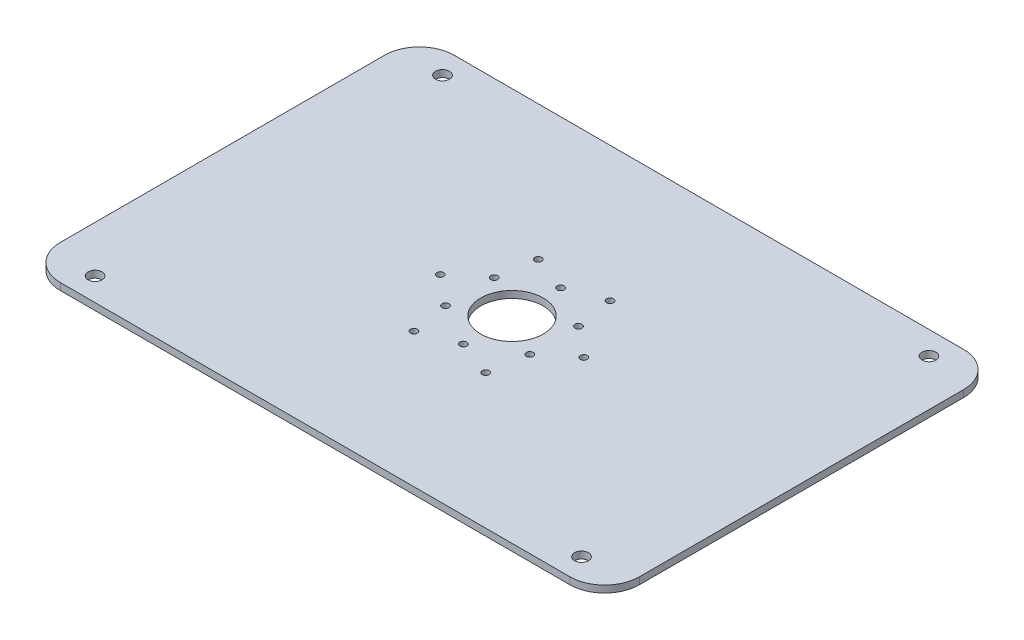
ISO-10303-21;
HEADER;
FILE_DESCRIPTION(('STEP AP214'),'2;1');
FILE_NAME('part.step','',(''),(''),'','','');
FILE_SCHEMA(('AUTOMOTIVE_DESIGN { 1 0 10303 214 1 1 1 1 }'));
ENDSEC;
DATA;
#1=APPLICATION_CONTEXT('core data for automotive mechanical design processes');
#2=APPLICATION_PROTOCOL_DEFINITION('international standard','automotive_design',2000,#1);
#3=PRODUCT_CONTEXT('',#1,'mechanical');
#4=PRODUCT('Part','Part','',(#3));
#5=PRODUCT_RELATED_PRODUCT_CATEGORY('part','',(#4));
#6=PRODUCT_DEFINITION_FORMATION('','',#4);
#7=PRODUCT_DEFINITION_CONTEXT('part definition',#1,'design');
#8=PRODUCT_DEFINITION('design','',#6,#7);
#9=PRODUCT_DEFINITION_SHAPE('','',#8);
#10=(LENGTH_UNIT() NAMED_UNIT(*) SI_UNIT(.MILLI.,.METRE.));
#11=(NAMED_UNIT(*) PLANE_ANGLE_UNIT() SI_UNIT($,.RADIAN.));
#12=(NAMED_UNIT(*) SI_UNIT($,.STERADIAN.) SOLID_ANGLE_UNIT());
#13=UNCERTAINTY_MEASURE_WITH_UNIT(LENGTH_MEASURE(1.E-05),#10,'distance_accuracy_value','');
#14=(GEOMETRIC_REPRESENTATION_CONTEXT(3) GLOBAL_UNCERTAINTY_ASSIGNED_CONTEXT((#13)) GLOBAL_UNIT_ASSIGNED_CONTEXT((#10,
#11,#12)) REPRESENTATION_CONTEXT('',''));
#15=CARTESIAN_POINT('',(0.,0.,0.));
#16=DIRECTION('',(0.,0.,1.));
#17=DIRECTION('',(1.,0.,0.));
#18=AXIS2_PLACEMENT_3D('',#15,#16,#17);
#19=CARTESIAN_POINT('',(0.,3.,0.));
#20=DIRECTION('',(0.,-1.,0.));
#21=DIRECTION('',(0.,0.,-1.));
#22=AXIS2_PLACEMENT_3D('',#19,#20,#21);
#23=PLANE('',#22);
#24=CARTESIAN_POINT('',(-18.1865334794709,3.,-10.5000000000041));
#25=DIRECTION('',(0.,1.,0.));
#26=DIRECTION('',(0.,0.,1.));
#27=AXIS2_PLACEMENT_3D('',#24,#25,#26);
#28=CIRCLE('',#27,1.49999999999574);
#29=CARTESIAN_POINT('',(-18.1865334794709,3.,-9.00000000000834));
#30=VERTEX_POINT('',#29);
#31=EDGE_CURVE('E213',#30,#30,#28,.T.);
#32=ORIENTED_EDGE('',*,*,#31,.F.);
#33=EDGE_LOOP('',(#32));
#34=FACE_BOUND('',#33,.T.);
#35=CARTESIAN_POINT('',(31.,3.,0.));
#36=DIRECTION('',(0.,1.,0.));
#37=DIRECTION('',(0.,0.,1.));
#38=AXIS2_PLACEMENT_3D('',#35,#36,#37);
#39=CIRCLE('',#38,1.5);
#40=CARTESIAN_POINT('',(31.,3.,1.5));
#41=VERTEX_POINT('',#40);
#42=EDGE_CURVE('E236',#41,#41,#39,.T.);
#43=ORIENTED_EDGE('',*,*,#42,.F.);
#44=EDGE_LOOP('',(#43));
#45=FACE_BOUND('',#44,.T.);
#46=CARTESIAN_POINT('',(1.78542417755903E-12,3.,0.));
#47=DIRECTION('',(0.,1.,0.));
#48=DIRECTION('',(0.,0.,1.));
#49=AXIS2_PLACEMENT_3D('',#46,#47,#48);
#50=CIRCLE('',#49,13.5);
#51=CARTESIAN_POINT('',(1.78542417755903E-12,3.,13.5));
#52=VERTEX_POINT('',#51);
#53=EDGE_CURVE('E237',#52,#52,#50,.T.);
#54=ORIENTED_EDGE('',*,*,#53,.F.);
#55=EDGE_LOOP('',(#54));
#56=FACE_BOUND('',#55,.T.);
#57=CARTESIAN_POINT('',(15.4999999999999,3.,26.8467875173176));
#58=DIRECTION('',(0.,1.,0.));
#59=DIRECTION('',(0.,0.,1.));
#60=AXIS2_PLACEMENT_3D('',#57,#58,#59);
#61=CIRCLE('',#60,1.5);
#62=CARTESIAN_POINT('',(15.4999999999999,3.,28.3467875173176));
#63=VERTEX_POINT('',#62);
#64=EDGE_CURVE('E248',#63,#63,#61,.T.);
#65=ORIENTED_EDGE('',*,*,#64,.F.);
#66=EDGE_LOOP('',(#65));
#67=FACE_BOUND('',#66,.T.);
#68=CARTESIAN_POINT('',(-18.1865334794751,3.,10.4999999999967));
#69=DIRECTION('',(0.,1.,0.));
#70=DIRECTION('',(0.,0.,1.));
#71=AXIS2_PLACEMENT_3D('',#68,#69,#70);
#72=CIRCLE('',#71,1.49999999999659);
#73=CARTESIAN_POINT('',(-18.1865334794751,3.,11.9999999999933));
#74=VERTEX_POINT('',#73);
#75=EDGE_CURVE('E212',#74,#74,#72,.T.);
#76=ORIENTED_EDGE('',*,*,#75,.F.);
#77=EDGE_LOOP('',(#76));
#78=FACE_BOUND('',#77,.T.);
#79=CARTESIAN_POINT('',(-1.46642216231412E-13,3.,21.));
#80=DIRECTION('',(0.,1.,0.));
#81=DIRECTION('',(0.,0.,1.));
#82=AXIS2_PLACEMENT_3D('',#79,#80,#81);
#83=CIRCLE('',#82,1.5);
#84=CARTESIAN_POINT('',(-1.46642216231412E-13,3.,22.5));
#85=VERTEX_POINT('',#84);
#86=EDGE_CURVE('E219',#85,#85,#83,.T.);
#87=ORIENTED_EDGE('',*,*,#86,.F.);
#88=EDGE_LOOP('',(#87));
#89=FACE_BOUND('',#88,.T.);
#90=CARTESIAN_POINT('',(18.1865334794732,3.,10.5000000000001));
#91=DIRECTION('',(0.,1.,0.));
#92=DIRECTION('',(0.,0.,1.));
#93=AXIS2_PLACEMENT_3D('',#90,#91,#92);
#94=CIRCLE('',#93,1.5);
#95=CARTESIAN_POINT('',(18.1865334794732,3.,12.0000000000001));
#96=VERTEX_POINT('',#95);
#97=EDGE_CURVE('E225',#96,#96,#94,.T.);
#98=ORIENTED_EDGE('',*,*,#97,.F.);
#99=EDGE_LOOP('',(#98));
#100=FACE_BOUND('',#99,.T.);
#101=CARTESIAN_POINT('',(18.1865334794732,3.,-10.5));
#102=DIRECTION('',(0.,1.,0.));
#103=DIRECTION('',(0.,0.,1.));
#104=AXIS2_PLACEMENT_3D('',#101,#102,#103);
#105=CIRCLE('',#104,1.5);
#106=CARTESIAN_POINT('',(18.1865334794732,3.,-8.99999999999996));
#107=VERTEX_POINT('',#106);
#108=EDGE_CURVE('E206',#107,#107,#105,.T.);
#109=ORIENTED_EDGE('',*,*,#108,.F.);
#110=EDGE_LOOP('',(#109));
#111=FACE_BOUND('',#110,.T.);
#112=CARTESIAN_POINT('',(-15.5000000000001,3.,26.8467875173175));
#113=DIRECTION('',(0.,1.,0.));
#114=DIRECTION('',(0.,0.,1.));
#115=AXIS2_PLACEMENT_3D('',#112,#113,#114);
#116=CIRCLE('',#115,1.5);
#117=CARTESIAN_POINT('',(-15.5000000000001,3.,28.3467875173175));
#118=VERTEX_POINT('',#117);
#119=EDGE_CURVE('E249',#118,#118,#116,.T.);
#120=ORIENTED_EDGE('',*,*,#119,.F.);
#121=EDGE_LOOP('',(#120));
#122=FACE_BOUND('',#121,.T.);
#123=CARTESIAN_POINT('',(-31.,3.,0.));
#124=DIRECTION('',(0.,1.,0.));
#125=DIRECTION('',(0.,0.,1.));
#126=AXIS2_PLACEMENT_3D('',#123,#124,#125);
#127=CIRCLE('',#126,1.49999999999994);
#128=CARTESIAN_POINT('',(-31.,3.,1.49999999999994));
#129=VERTEX_POINT('',#128);
#130=EDGE_CURVE('E272',#129,#129,#127,.T.);
#131=ORIENTED_EDGE('',*,*,#130,.F.);
#132=EDGE_LOOP('',(#131));
#133=FACE_BOUND('',#132,.T.);
#134=CARTESIAN_POINT('',(-15.4999999999997,3.,-26.8467875173177));
#135=DIRECTION('',(0.,1.,0.));
#136=DIRECTION('',(0.,0.,1.));
#137=AXIS2_PLACEMENT_3D('',#134,#135,#136);
#138=CIRCLE('',#137,1.5);
#139=CARTESIAN_POINT('',(-15.4999999999997,3.,-25.3467875173177));
#140=VERTEX_POINT('',#139);
#141=EDGE_CURVE('E266',#140,#140,#138,.T.);
#142=ORIENTED_EDGE('',*,*,#141,.F.);
#143=EDGE_LOOP('',(#142));
#144=FACE_BOUND('',#143,.T.);
#145=CARTESIAN_POINT('',(15.5000000000003,3.,-26.8467875173174));
#146=DIRECTION('',(0.,1.,0.));
#147=DIRECTION('',(0.,0.,1.));
#148=AXIS2_PLACEMENT_3D('',#145,#146,#147);
#149=CIRCLE('',#148,1.5);
#150=CARTESIAN_POINT('',(15.5000000000003,3.,-25.3467875173174));
#151=VERTEX_POINT('',#150);
#152=EDGE_CURVE('E260',#151,#151,#149,.T.);
#153=ORIENTED_EDGE('',*,*,#152,.F.);
#154=EDGE_LOOP('',(#153));
#155=FACE_BOUND('',#154,.T.);
#156=CARTESIAN_POINT('',(0.,3.,-21.));
#157=DIRECTION('',(0.,1.,0.));
#158=DIRECTION('',(0.,0.,1.));
#159=AXIS2_PLACEMENT_3D('',#156,#157,#158);
#160=CIRCLE('',#159,1.5);
#161=CARTESIAN_POINT('',(0.,3.,-19.5));
#162=VERTEX_POINT('',#161);
#163=EDGE_CURVE('E200',#162,#162,#160,.T.);
#164=ORIENTED_EDGE('',*,*,#163,.F.);
#165=EDGE_LOOP('',(#164));
#166=FACE_BOUND('',#165,.T.);
#167=DIRECTION('',(1.,0.,0.));
#168=VECTOR('',#167,1.);
#169=CARTESIAN_POINT('',(-125.,3.,85.));
#170=LINE('',#169,#168);
#171=CARTESIAN_POINT('',(-110.,3.,85.));
#172=VERTEX_POINT('',#171);
#173=CARTESIAN_POINT('',(110.,3.,85.));
#174=VERTEX_POINT('',#173);
#175=EDGE_CURVE('E138',#172,#174,#170,.T.);
#176=ORIENTED_EDGE('',*,*,#175,.T.);
#177=CARTESIAN_POINT('',(110.,3.,70.));
#178=DIRECTION('',(0.,-1.,0.));
#179=DIRECTION('',(0.,0.,-1.));
#180=AXIS2_PLACEMENT_3D('',#177,#178,#179);
#181=CIRCLE('',#180,15.);
#182=CARTESIAN_POINT('',(125.,3.,70.));
#183=VERTEX_POINT('',#182);
#184=EDGE_CURVE('E157',#174,#183,#181,.F.);
#185=ORIENTED_EDGE('',*,*,#184,.T.);
#186=DIRECTION('',(0.,0.,-1.));
#187=VECTOR('',#186,1.);
#188=CARTESIAN_POINT('',(125.,3.,85.));
#189=LINE('',#188,#187);
#190=CARTESIAN_POINT('',(125.,3.,-70.));
#191=VERTEX_POINT('',#190);
#192=EDGE_CURVE('E121',#183,#191,#189,.T.);
#193=ORIENTED_EDGE('',*,*,#192,.T.);
#194=CARTESIAN_POINT('',(110.,3.,-70.));
#195=DIRECTION('',(0.,-1.,0.));
#196=DIRECTION('',(0.,0.,-1.));
#197=AXIS2_PLACEMENT_3D('',#194,#195,#196);
#198=CIRCLE('',#197,15.);
#199=CARTESIAN_POINT('',(110.,3.,-85.));
#200=VERTEX_POINT('',#199);
#201=EDGE_CURVE('E155',#191,#200,#198,.F.);
#202=ORIENTED_EDGE('',*,*,#201,.T.);
#203=DIRECTION('',(-1.,0.,0.));
#204=VECTOR('',#203,1.);
#205=CARTESIAN_POINT('',(-125.,3.,-85.));
#206=LINE('',#205,#204);
#207=CARTESIAN_POINT('',(-110.,3.,-85.));
#208=VERTEX_POINT('',#207);
#209=EDGE_CURVE('E168',#200,#208,#206,.T.);
#210=ORIENTED_EDGE('',*,*,#209,.T.);
#211=CARTESIAN_POINT('',(-110.,3.,-70.));
#212=DIRECTION('',(0.,-1.,0.));
#213=DIRECTION('',(0.,0.,-1.));
#214=AXIS2_PLACEMENT_3D('',#211,#212,#213);
#215=CIRCLE('',#214,15.);
#216=CARTESIAN_POINT('',(-125.,3.,-70.));
#217=VERTEX_POINT('',#216);
#218=EDGE_CURVE('E56',#208,#217,#215,.F.);
#219=ORIENTED_EDGE('',*,*,#218,.T.);
#220=DIRECTION('',(0.,0.,1.));
#221=VECTOR('',#220,1.);
#222=CARTESIAN_POINT('',(-125.,3.,85.));
#223=LINE('',#222,#221);
#224=CARTESIAN_POINT('',(-125.,3.,70.));
#225=VERTEX_POINT('',#224);
#226=EDGE_CURVE('E176',#217,#225,#223,.T.);
#227=ORIENTED_EDGE('',*,*,#226,.T.);
#228=CARTESIAN_POINT('',(-110.,3.,70.));
#229=DIRECTION('',(0.,-1.,0.));
#230=DIRECTION('',(0.,0.,-1.));
#231=AXIS2_PLACEMENT_3D('',#228,#229,#230);
#232=CIRCLE('',#231,15.);
#233=EDGE_CURVE('E152',#225,#172,#232,.F.);
#234=ORIENTED_EDGE('',*,*,#233,.T.);
#235=EDGE_LOOP('',(#176,#185,#193,#202,#210,#219,#227,#234));
#236=FACE_BOUND('',#235,.T.);
#237=CARTESIAN_POINT('',(-105.,3.,-75.));
#238=DIRECTION('',(0.,1.,0.));
#239=DIRECTION('',(0.,0.,1.));
#240=AXIS2_PLACEMENT_3D('',#237,#238,#239);
#241=CIRCLE('',#240,3.00000000000001);
#242=CARTESIAN_POINT('',(-105.,3.,-72.));
#243=VERTEX_POINT('',#242);
#244=EDGE_CURVE('E129',#243,#243,#241,.T.);
#245=ORIENTED_EDGE('',*,*,#244,.F.);
#246=EDGE_LOOP('',(#245));
#247=FACE_BOUND('',#246,.T.);
#248=CARTESIAN_POINT('',(105.,3.,-75.));
#249=DIRECTION('',(0.,1.,0.));
#250=DIRECTION('',(0.,0.,1.));
#251=AXIS2_PLACEMENT_3D('',#248,#249,#250);
#252=CIRCLE('',#251,3.00000000000001);
#253=CARTESIAN_POINT('',(105.,3.,-72.));
#254=VERTEX_POINT('',#253);
#255=EDGE_CURVE('E183',#254,#254,#252,.T.);
#256=ORIENTED_EDGE('',*,*,#255,.F.);
#257=EDGE_LOOP('',(#256));
#258=FACE_BOUND('',#257,.T.);
#259=CARTESIAN_POINT('',(-105.,3.,75.));
#260=DIRECTION('',(0.,1.,0.));
#261=DIRECTION('',(0.,0.,1.));
#262=AXIS2_PLACEMENT_3D('',#259,#260,#261);
#263=CIRCLE('',#262,3.00000000000001);
#264=CARTESIAN_POINT('',(-105.,3.,78.));
#265=VERTEX_POINT('',#264);
#266=EDGE_CURVE('E188',#265,#265,#263,.T.);
#267=ORIENTED_EDGE('',*,*,#266,.F.);
#268=EDGE_LOOP('',(#267));
#269=FACE_BOUND('',#268,.T.);
#270=CARTESIAN_POINT('',(105.,3.,75.));
#271=DIRECTION('',(0.,1.,0.));
#272=DIRECTION('',(0.,0.,1.));
#273=AXIS2_PLACEMENT_3D('',#270,#271,#272);
#274=CIRCLE('',#273,3.00000000000001);
#275=CARTESIAN_POINT('',(105.,3.,78.));
#276=VERTEX_POINT('',#275);
#277=EDGE_CURVE('E194',#276,#276,#274,.T.);
#278=ORIENTED_EDGE('',*,*,#277,.F.);
#279=EDGE_LOOP('',(#278));
#280=FACE_BOUND('',#279,.T.);
#281=ADVANCED_FACE('F35',(#34,#45,#56,#67,#78,#89,#100,#111,#122,#133,#144,#155,#166,#236,#247,
#258,#269,#280),#23,.F.);
#282=CARTESIAN_POINT('',(0.,0.,0.));
#283=DIRECTION('',(0.,-1.,0.));
#284=DIRECTION('',(0.,0.,-1.));
#285=AXIS2_PLACEMENT_3D('',#282,#283,#284);
#286=PLANE('',#285);
#287=CARTESIAN_POINT('',(-18.1865334794709,0.,-10.5000000000041));
#288=DIRECTION('',(0.,1.,0.));
#289=DIRECTION('',(0.,0.,1.));
#290=AXIS2_PLACEMENT_3D('',#287,#288,#289);
#291=CIRCLE('',#290,1.49999999999574);
#292=CARTESIAN_POINT('',(-18.1865334794709,0.,-9.00000000000834));
#293=VERTEX_POINT('',#292);
#294=EDGE_CURVE('E240',#293,#293,#291,.T.);
#295=ORIENTED_EDGE('',*,*,#294,.T.);
#296=EDGE_LOOP('',(#295));
#297=FACE_BOUND('',#296,.T.);
#298=CARTESIAN_POINT('',(31.,0.,0.));
#299=DIRECTION('',(0.,1.,0.));
#300=DIRECTION('',(0.,0.,1.));
#301=AXIS2_PLACEMENT_3D('',#298,#299,#300);
#302=CIRCLE('',#301,1.5);
#303=CARTESIAN_POINT('',(31.,0.,1.5));
#304=VERTEX_POINT('',#303);
#305=EDGE_CURVE('E233',#304,#304,#302,.T.);
#306=ORIENTED_EDGE('',*,*,#305,.T.);
#307=EDGE_LOOP('',(#306));
#308=FACE_BOUND('',#307,.T.);
#309=CARTESIAN_POINT('',(1.78542417755903E-12,0.,0.));
#310=DIRECTION('',(0.,1.,0.));
#311=DIRECTION('',(0.,0.,1.));
#312=AXIS2_PLACEMENT_3D('',#309,#310,#311);
#313=CIRCLE('',#312,13.5);
#314=CARTESIAN_POINT('',(1.78542417755903E-12,0.,13.5));
#315=VERTEX_POINT('',#314);
#316=EDGE_CURVE('E252',#315,#315,#313,.T.);
#317=ORIENTED_EDGE('',*,*,#316,.T.);
#318=EDGE_LOOP('',(#317));
#319=FACE_BOUND('',#318,.T.);
#320=CARTESIAN_POINT('',(15.4999999999999,0.,26.8467875173176));
#321=DIRECTION('',(0.,1.,0.));
#322=DIRECTION('',(0.,0.,1.));
#323=AXIS2_PLACEMENT_3D('',#320,#321,#322);
#324=CIRCLE('',#323,1.5);
#325=CARTESIAN_POINT('',(15.4999999999999,0.,28.3467875173176));
#326=VERTEX_POINT('',#325);
#327=EDGE_CURVE('E245',#326,#326,#324,.T.);
#328=ORIENTED_EDGE('',*,*,#327,.T.);
#329=EDGE_LOOP('',(#328));
#330=FACE_BOUND('',#329,.T.);
#331=CARTESIAN_POINT('',(-18.1865334794751,0.,10.4999999999967));
#332=DIRECTION('',(0.,1.,0.));
#333=DIRECTION('',(0.,0.,1.));
#334=AXIS2_PLACEMENT_3D('',#331,#332,#333);
#335=CIRCLE('',#334,1.49999999999659);
#336=CARTESIAN_POINT('',(-18.1865334794751,0.,11.9999999999933));
#337=VERTEX_POINT('',#336);
#338=EDGE_CURVE('E209',#337,#337,#335,.T.);
#339=ORIENTED_EDGE('',*,*,#338,.T.);
#340=EDGE_LOOP('',(#339));
#341=FACE_BOUND('',#340,.T.);
#342=CARTESIAN_POINT('',(-1.46642216231412E-13,0.,21.));
#343=DIRECTION('',(0.,1.,0.));
#344=DIRECTION('',(0.,0.,1.));
#345=AXIS2_PLACEMENT_3D('',#342,#343,#344);
#346=CIRCLE('',#345,1.5);
#347=CARTESIAN_POINT('',(-1.46642216231412E-13,0.,22.5));
#348=VERTEX_POINT('',#347);
#349=EDGE_CURVE('E216',#348,#348,#346,.T.);
#350=ORIENTED_EDGE('',*,*,#349,.T.);
#351=EDGE_LOOP('',(#350));
#352=FACE_BOUND('',#351,.T.);
#353=CARTESIAN_POINT('',(18.1865334794732,0.,10.5000000000001));
#354=DIRECTION('',(0.,1.,0.));
#355=DIRECTION('',(0.,0.,1.));
#356=AXIS2_PLACEMENT_3D('',#353,#354,#355);
#357=CIRCLE('',#356,1.5);
#358=CARTESIAN_POINT('',(18.1865334794732,0.,12.0000000000001));
#359=VERTEX_POINT('',#358);
#360=EDGE_CURVE('E222',#359,#359,#357,.T.);
#361=ORIENTED_EDGE('',*,*,#360,.T.);
#362=EDGE_LOOP('',(#361));
#363=FACE_BOUND('',#362,.T.);
#364=CARTESIAN_POINT('',(18.1865334794732,0.,-10.5));
#365=DIRECTION('',(0.,1.,0.));
#366=DIRECTION('',(0.,0.,1.));
#367=AXIS2_PLACEMENT_3D('',#364,#365,#366);
#368=CIRCLE('',#367,1.5);
#369=CARTESIAN_POINT('',(18.1865334794732,0.,-8.99999999999996));
#370=VERTEX_POINT('',#369);
#371=EDGE_CURVE('E228',#370,#370,#368,.T.);
#372=ORIENTED_EDGE('',*,*,#371,.T.);
#373=EDGE_LOOP('',(#372));
#374=FACE_BOUND('',#373,.T.);
#375=CARTESIAN_POINT('',(-15.5000000000001,0.,26.8467875173175));
#376=DIRECTION('',(0.,1.,0.));
#377=DIRECTION('',(0.,0.,1.));
#378=AXIS2_PLACEMENT_3D('',#375,#376,#377);
#379=CIRCLE('',#378,1.5);
#380=CARTESIAN_POINT('',(-15.5000000000001,0.,28.3467875173175));
#381=VERTEX_POINT('',#380);
#382=EDGE_CURVE('E275',#381,#381,#379,.T.);
#383=ORIENTED_EDGE('',*,*,#382,.T.);
#384=EDGE_LOOP('',(#383));
#385=FACE_BOUND('',#384,.T.);
#386=CARTESIAN_POINT('',(-31.,0.,0.));
#387=DIRECTION('',(0.,1.,0.));
#388=DIRECTION('',(0.,0.,1.));
#389=AXIS2_PLACEMENT_3D('',#386,#387,#388);
#390=CIRCLE('',#389,1.49999999999994);
#391=CARTESIAN_POINT('',(-31.,0.,1.49999999999994));
#392=VERTEX_POINT('',#391);
#393=EDGE_CURVE('E269',#392,#392,#390,.T.);
#394=ORIENTED_EDGE('',*,*,#393,.T.);
#395=EDGE_LOOP('',(#394));
#396=FACE_BOUND('',#395,.T.);
#397=CARTESIAN_POINT('',(-15.4999999999997,0.,-26.8467875173177));
#398=DIRECTION('',(0.,1.,0.));
#399=DIRECTION('',(0.,0.,1.));
#400=AXIS2_PLACEMENT_3D('',#397,#398,#399);
#401=CIRCLE('',#400,1.5);
#402=CARTESIAN_POINT('',(-15.4999999999997,0.,-25.3467875173177));
#403=VERTEX_POINT('',#402);
#404=EDGE_CURVE('E263',#403,#403,#401,.T.);
#405=ORIENTED_EDGE('',*,*,#404,.T.);
#406=EDGE_LOOP('',(#405));
#407=FACE_BOUND('',#406,.T.);
#408=CARTESIAN_POINT('',(15.5000000000003,0.,-26.8467875173174));
#409=DIRECTION('',(0.,1.,0.));
#410=DIRECTION('',(0.,0.,1.));
#411=AXIS2_PLACEMENT_3D('',#408,#409,#410);
#412=CIRCLE('',#411,1.5);
#413=CARTESIAN_POINT('',(15.5000000000003,0.,-25.3467875173174));
#414=VERTEX_POINT('',#413);
#415=EDGE_CURVE('E257',#414,#414,#412,.T.);
#416=ORIENTED_EDGE('',*,*,#415,.T.);
#417=EDGE_LOOP('',(#416));
#418=FACE_BOUND('',#417,.T.);
#419=CARTESIAN_POINT('',(0.,0.,-21.));
#420=DIRECTION('',(0.,1.,0.));
#421=DIRECTION('',(0.,0.,1.));
#422=AXIS2_PLACEMENT_3D('',#419,#420,#421);
#423=CIRCLE('',#422,1.5);
#424=CARTESIAN_POINT('',(0.,0.,-19.5));
#425=VERTEX_POINT('',#424);
#426=EDGE_CURVE('E203',#425,#425,#423,.T.);
#427=ORIENTED_EDGE('',*,*,#426,.T.);
#428=EDGE_LOOP('',(#427));
#429=FACE_BOUND('',#428,.T.);
#430=CARTESIAN_POINT('',(-105.,0.,75.));
#431=DIRECTION('',(0.,1.,0.));
#432=DIRECTION('',(0.,0.,1.));
#433=AXIS2_PLACEMENT_3D('',#430,#431,#432);
#434=CIRCLE('',#433,3.00000000000001);
#435=CARTESIAN_POINT('',(-105.,0.,78.));
#436=VERTEX_POINT('',#435);
#437=EDGE_CURVE('E191',#436,#436,#434,.T.);
#438=ORIENTED_EDGE('',*,*,#437,.T.);
#439=EDGE_LOOP('',(#438));
#440=FACE_BOUND('',#439,.T.);
#441=CARTESIAN_POINT('',(-105.,0.,-75.));
#442=DIRECTION('',(0.,1.,0.));
#443=DIRECTION('',(0.,0.,1.));
#444=AXIS2_PLACEMENT_3D('',#441,#442,#443);
#445=CIRCLE('',#444,3.00000000000001);
#446=CARTESIAN_POINT('',(-105.,0.,-72.));
#447=VERTEX_POINT('',#446);
#448=EDGE_CURVE('E135',#447,#447,#445,.T.);
#449=ORIENTED_EDGE('',*,*,#448,.T.);
#450=EDGE_LOOP('',(#449));
#451=FACE_BOUND('',#450,.T.);
#452=DIRECTION('',(0.,0.,-1.));
#453=VECTOR('',#452,1.);
#454=CARTESIAN_POINT('',(125.,0.,85.));
#455=LINE('',#454,#453);
#456=CARTESIAN_POINT('',(125.,0.,70.));
#457=VERTEX_POINT('',#456);
#458=CARTESIAN_POINT('',(125.,0.,-70.));
#459=VERTEX_POINT('',#458);
#460=EDGE_CURVE('E118',#457,#459,#455,.T.);
#461=ORIENTED_EDGE('',*,*,#460,.F.);
#462=CARTESIAN_POINT('',(110.,0.,70.));
#463=DIRECTION('',(0.,-1.,0.));
#464=DIRECTION('',(0.,0.,-1.));
#465=AXIS2_PLACEMENT_3D('',#462,#463,#464);
#466=CIRCLE('',#465,15.);
#467=CARTESIAN_POINT('',(110.,0.,85.));
#468=VERTEX_POINT('',#467);
#469=EDGE_CURVE('E101',#457,#468,#466,.T.);
#470=ORIENTED_EDGE('',*,*,#469,.T.);
#471=DIRECTION('',(1.,0.,0.));
#472=VECTOR('',#471,1.);
#473=CARTESIAN_POINT('',(-125.,0.,85.));
#474=LINE('',#473,#472);
#475=CARTESIAN_POINT('',(-110.,0.,85.));
#476=VERTEX_POINT('',#475);
#477=EDGE_CURVE('E142',#476,#468,#474,.T.);
#478=ORIENTED_EDGE('',*,*,#477,.F.);
#479=CARTESIAN_POINT('',(-110.,0.,70.));
#480=DIRECTION('',(0.,-1.,0.));
#481=DIRECTION('',(0.,0.,-1.));
#482=AXIS2_PLACEMENT_3D('',#479,#480,#481);
#483=CIRCLE('',#482,15.);
#484=CARTESIAN_POINT('',(-125.,0.,70.));
#485=VERTEX_POINT('',#484);
#486=EDGE_CURVE('E122',#476,#485,#483,.T.);
#487=ORIENTED_EDGE('',*,*,#486,.T.);
#488=DIRECTION('',(0.,0.,1.));
#489=VECTOR('',#488,1.);
#490=CARTESIAN_POINT('',(-125.,0.,85.));
#491=LINE('',#490,#489);
#492=CARTESIAN_POINT('',(-125.,0.,-70.));
#493=VERTEX_POINT('',#492);
#494=EDGE_CURVE('E132',#493,#485,#491,.T.);
#495=ORIENTED_EDGE('',*,*,#494,.F.);
#496=CARTESIAN_POINT('',(-110.,0.,-70.));
#497=DIRECTION('',(0.,-1.,0.));
#498=DIRECTION('',(0.,0.,-1.));
#499=AXIS2_PLACEMENT_3D('',#496,#497,#498);
#500=CIRCLE('',#499,15.);
#501=CARTESIAN_POINT('',(-110.,0.,-85.));
#502=VERTEX_POINT('',#501);
#503=EDGE_CURVE('E146',#493,#502,#500,.T.);
#504=ORIENTED_EDGE('',*,*,#503,.T.);
#505=DIRECTION('',(-1.,0.,0.));
#506=VECTOR('',#505,1.);
#507=CARTESIAN_POINT('',(-125.,0.,-85.));
#508=LINE('',#507,#506);
#509=CARTESIAN_POINT('',(110.,0.,-85.));
#510=VERTEX_POINT('',#509);
#511=EDGE_CURVE('E128',#510,#502,#508,.T.);
#512=ORIENTED_EDGE('',*,*,#511,.F.);
#513=CARTESIAN_POINT('',(110.,0.,-70.));
#514=DIRECTION('',(0.,-1.,0.));
#515=DIRECTION('',(0.,0.,-1.));
#516=AXIS2_PLACEMENT_3D('',#513,#514,#515);
#517=CIRCLE('',#516,15.);
#518=EDGE_CURVE('E112',#510,#459,#517,.T.);
#519=ORIENTED_EDGE('',*,*,#518,.T.);
#520=EDGE_LOOP('',(#461,#470,#478,#487,#495,#504,#512,#519));
#521=FACE_BOUND('',#520,.T.);
#522=CARTESIAN_POINT('',(105.,0.,-75.));
#523=DIRECTION('',(0.,1.,0.));
#524=DIRECTION('',(0.,0.,1.));
#525=AXIS2_PLACEMENT_3D('',#522,#523,#524);
#526=CIRCLE('',#525,3.00000000000001);
#527=CARTESIAN_POINT('',(105.,0.,-72.));
#528=VERTEX_POINT('',#527);
#529=EDGE_CURVE('E185',#528,#528,#526,.T.);
#530=ORIENTED_EDGE('',*,*,#529,.T.);
#531=EDGE_LOOP('',(#530));
#532=FACE_BOUND('',#531,.T.);
#533=CARTESIAN_POINT('',(105.,0.,75.));
#534=DIRECTION('',(0.,1.,0.));
#535=DIRECTION('',(0.,0.,1.));
#536=AXIS2_PLACEMENT_3D('',#533,#534,#535);
#537=CIRCLE('',#536,3.00000000000001);
#538=CARTESIAN_POINT('',(105.,0.,78.));
#539=VERTEX_POINT('',#538);
#540=EDGE_CURVE('E197',#539,#539,#537,.T.);
#541=ORIENTED_EDGE('',*,*,#540,.T.);
#542=EDGE_LOOP('',(#541));
#543=FACE_BOUND('',#542,.T.);
#544=ADVANCED_FACE('F125',(#297,#308,#319,#330,#341,#352,#363,#374,#385,#396,#407,#418,#429,
#440,#451,#521,#532,#543),#286,.T.);
#545=CARTESIAN_POINT('',(125.,3.,85.));
#546=DIRECTION('',(-1.,0.,0.));
#547=DIRECTION('',(0.,0.,1.));
#548=AXIS2_PLACEMENT_3D('',#545,#546,#547);
#549=PLANE('',#548);
#550=ORIENTED_EDGE('',*,*,#192,.F.);
#551=DIRECTION('',(0.,-1.,0.));
#552=VECTOR('',#551,1.);
#553=CARTESIAN_POINT('',(125.,3.,70.));
#554=LINE('',#553,#552);
#555=EDGE_CURVE('E105',#183,#457,#554,.T.);
#556=ORIENTED_EDGE('',*,*,#555,.T.);
#557=ORIENTED_EDGE('',*,*,#460,.T.);
#558=DIRECTION('',(0.,-1.,0.));
#559=VECTOR('',#558,1.);
#560=CARTESIAN_POINT('',(125.,3.,-70.));
#561=LINE('',#560,#559);
#562=EDGE_CURVE('E123',#459,#191,#561,.F.);
#563=ORIENTED_EDGE('',*,*,#562,.T.);
#564=EDGE_LOOP('',(#550,#556,#557,#563));
#565=FACE_BOUND('',#564,.T.);
#566=ADVANCED_FACE('F117',(#565),#549,.F.);
#567=CARTESIAN_POINT('',(-125.,3.,-85.));
#568=DIRECTION('',(0.,0.,1.));
#569=DIRECTION('',(1.,0.,0.));
#570=AXIS2_PLACEMENT_3D('',#567,#568,#569);
#571=PLANE('',#570);
#572=ORIENTED_EDGE('',*,*,#209,.F.);
#573=DIRECTION('',(0.,-1.,0.));
#574=VECTOR('',#573,1.);
#575=CARTESIAN_POINT('',(110.,3.,-85.));
#576=LINE('',#575,#574);
#577=EDGE_CURVE('E161',#200,#510,#576,.T.);
#578=ORIENTED_EDGE('',*,*,#577,.T.);
#579=ORIENTED_EDGE('',*,*,#511,.T.);
#580=DIRECTION('',(0.,-1.,0.));
#581=VECTOR('',#580,1.);
#582=CARTESIAN_POINT('',(-110.,3.,-85.));
#583=LINE('',#582,#581);
#584=EDGE_CURVE('E159',#502,#208,#583,.F.);
#585=ORIENTED_EDGE('',*,*,#584,.T.);
#586=EDGE_LOOP('',(#572,#578,#579,#585));
#587=FACE_BOUND('',#586,.T.);
#588=ADVANCED_FACE('F166',(#587),#571,.F.);
#589=CARTESIAN_POINT('',(-125.,3.,85.));
#590=DIRECTION('',(1.,0.,0.));
#591=DIRECTION('',(0.,0.,-1.));
#592=AXIS2_PLACEMENT_3D('',#589,#590,#591);
#593=PLANE('',#592);
#594=ORIENTED_EDGE('',*,*,#226,.F.);
#595=DIRECTION('',(0.,-1.,0.));
#596=VECTOR('',#595,1.);
#597=CARTESIAN_POINT('',(-125.,3.,-70.));
#598=LINE('',#597,#596);
#599=EDGE_CURVE('E11',#217,#493,#598,.T.);
#600=ORIENTED_EDGE('',*,*,#599,.T.);
#601=ORIENTED_EDGE('',*,*,#494,.T.);
#602=DIRECTION('',(0.,-1.,0.));
#603=VECTOR('',#602,1.);
#604=CARTESIAN_POINT('',(-125.,3.,70.));
#605=LINE('',#604,#603);
#606=EDGE_CURVE('E43',#485,#225,#605,.F.);
#607=ORIENTED_EDGE('',*,*,#606,.T.);
#608=EDGE_LOOP('',(#594,#600,#601,#607));
#609=FACE_BOUND('',#608,.T.);
#610=ADVANCED_FACE('F175',(#609),#593,.F.);
#611=CARTESIAN_POINT('',(-125.,3.,85.));
#612=DIRECTION('',(0.,0.,-1.));
#613=DIRECTION('',(-1.,0.,0.));
#614=AXIS2_PLACEMENT_3D('',#611,#612,#613);
#615=PLANE('',#614);
#616=ORIENTED_EDGE('',*,*,#477,.T.);
#617=DIRECTION('',(0.,-1.,0.));
#618=VECTOR('',#617,1.);
#619=CARTESIAN_POINT('',(110.,3.,85.));
#620=LINE('',#619,#618);
#621=EDGE_CURVE('E106',#468,#174,#620,.F.);
#622=ORIENTED_EDGE('',*,*,#621,.T.);
#623=ORIENTED_EDGE('',*,*,#175,.F.);
#624=DIRECTION('',(0.,-1.,0.));
#625=VECTOR('',#624,1.);
#626=CARTESIAN_POINT('',(-110.,3.,85.));
#627=LINE('',#626,#625);
#628=EDGE_CURVE('E111',#172,#476,#627,.T.);
#629=ORIENTED_EDGE('',*,*,#628,.T.);
#630=EDGE_LOOP('',(#616,#622,#623,#629));
#631=FACE_BOUND('',#630,.T.);
#632=ADVANCED_FACE('F322',(#631),#615,.F.);
#633=CARTESIAN_POINT('',(-105.,3.,-75.));
#634=DIRECTION('',(0.,-1.,0.));
#635=DIRECTION('',(0.,0.,-1.));
#636=AXIS2_PLACEMENT_3D('',#633,#634,#635);
#637=CYLINDRICAL_SURFACE('',#636,3.00000000000001);
#638=ORIENTED_EDGE('',*,*,#244,.T.);
#639=EDGE_LOOP('',(#638));
#640=FACE_BOUND('',#639,.T.);
#641=ORIENTED_EDGE('',*,*,#448,.F.);
#642=EDGE_LOOP('',(#641));
#643=FACE_BOUND('',#642,.T.);
#644=ADVANCED_FACE('F325',(#640,#643),#637,.F.);
#645=CARTESIAN_POINT('',(105.,3.,-75.));
#646=DIRECTION('',(0.,-1.,0.));
#647=DIRECTION('',(0.,0.,-1.));
#648=AXIS2_PLACEMENT_3D('',#645,#646,#647);
#649=CYLINDRICAL_SURFACE('',#648,3.00000000000001);
#650=ORIENTED_EDGE('',*,*,#255,.T.);
#651=EDGE_LOOP('',(#650));
#652=FACE_BOUND('',#651,.T.);
#653=ORIENTED_EDGE('',*,*,#529,.F.);
#654=EDGE_LOOP('',(#653));
#655=FACE_BOUND('',#654,.T.);
#656=ADVANCED_FACE('F361',(#652,#655),#649,.F.);
#657=CARTESIAN_POINT('',(-105.,3.,75.));
#658=DIRECTION('',(0.,-1.,0.));
#659=DIRECTION('',(0.,0.,-1.));
#660=AXIS2_PLACEMENT_3D('',#657,#658,#659);
#661=CYLINDRICAL_SURFACE('',#660,3.00000000000001);
#662=ORIENTED_EDGE('',*,*,#266,.T.);
#663=EDGE_LOOP('',(#662));
#664=FACE_BOUND('',#663,.T.);
#665=ORIENTED_EDGE('',*,*,#437,.F.);
#666=EDGE_LOOP('',(#665));
#667=FACE_BOUND('',#666,.T.);
#668=ADVANCED_FACE('F308',(#664,#667),#661,.F.);
#669=CARTESIAN_POINT('',(105.,3.,75.));
#670=DIRECTION('',(0.,-1.,0.));
#671=DIRECTION('',(0.,0.,-1.));
#672=AXIS2_PLACEMENT_3D('',#669,#670,#671);
#673=CYLINDRICAL_SURFACE('',#672,3.00000000000001);
#674=ORIENTED_EDGE('',*,*,#277,.T.);
#675=EDGE_LOOP('',(#674));
#676=FACE_BOUND('',#675,.T.);
#677=ORIENTED_EDGE('',*,*,#540,.F.);
#678=EDGE_LOOP('',(#677));
#679=FACE_BOUND('',#678,.T.);
#680=ADVANCED_FACE('F305',(#676,#679),#673,.F.);
#681=CARTESIAN_POINT('',(110.,3.,70.));
#682=DIRECTION('',(0.,-1.,0.));
#683=DIRECTION('',(0.,0.,-1.));
#684=AXIS2_PLACEMENT_3D('',#681,#682,#683);
#685=CYLINDRICAL_SURFACE('',#684,15.);
#686=ORIENTED_EDGE('',*,*,#184,.F.);
#687=ORIENTED_EDGE('',*,*,#621,.F.);
#688=ORIENTED_EDGE('',*,*,#469,.F.);
#689=ORIENTED_EDGE('',*,*,#555,.F.);
#690=EDGE_LOOP('',(#686,#687,#688,#689));
#691=FACE_BOUND('',#690,.T.);
#692=ADVANCED_FACE('F104',(#691),#685,.T.);
#693=CARTESIAN_POINT('',(110.,3.,-70.));
#694=DIRECTION('',(0.,-1.,0.));
#695=DIRECTION('',(0.,0.,-1.));
#696=AXIS2_PLACEMENT_3D('',#693,#694,#695);
#697=CYLINDRICAL_SURFACE('',#696,15.);
#698=ORIENTED_EDGE('',*,*,#201,.F.);
#699=ORIENTED_EDGE('',*,*,#562,.F.);
#700=ORIENTED_EDGE('',*,*,#518,.F.);
#701=ORIENTED_EDGE('',*,*,#577,.F.);
#702=EDGE_LOOP('',(#698,#699,#700,#701));
#703=FACE_BOUND('',#702,.T.);
#704=ADVANCED_FACE('F333',(#703),#697,.T.);
#705=CARTESIAN_POINT('',(-110.,3.,-70.));
#706=DIRECTION('',(0.,-1.,0.));
#707=DIRECTION('',(0.,0.,-1.));
#708=AXIS2_PLACEMENT_3D('',#705,#706,#707);
#709=CYLINDRICAL_SURFACE('',#708,15.);
#710=ORIENTED_EDGE('',*,*,#218,.F.);
#711=ORIENTED_EDGE('',*,*,#584,.F.);
#712=ORIENTED_EDGE('',*,*,#503,.F.);
#713=ORIENTED_EDGE('',*,*,#599,.F.);
#714=EDGE_LOOP('',(#710,#711,#712,#713));
#715=FACE_BOUND('',#714,.T.);
#716=ADVANCED_FACE('F174',(#715),#709,.T.);
#717=CARTESIAN_POINT('',(-110.,3.,70.));
#718=DIRECTION('',(0.,-1.,0.));
#719=DIRECTION('',(0.,0.,-1.));
#720=AXIS2_PLACEMENT_3D('',#717,#718,#719);
#721=CYLINDRICAL_SURFACE('',#720,15.);
#722=ORIENTED_EDGE('',*,*,#233,.F.);
#723=ORIENTED_EDGE('',*,*,#606,.F.);
#724=ORIENTED_EDGE('',*,*,#486,.F.);
#725=ORIENTED_EDGE('',*,*,#628,.F.);
#726=EDGE_LOOP('',(#722,#723,#724,#725));
#727=FACE_BOUND('',#726,.T.);
#728=ADVANCED_FACE('F37',(#727),#721,.T.);
#729=CARTESIAN_POINT('',(0.,3.,-21.));
#730=DIRECTION('',(0.,-1.,0.));
#731=DIRECTION('',(0.,0.,-1.));
#732=AXIS2_PLACEMENT_3D('',#729,#730,#731);
#733=CYLINDRICAL_SURFACE('',#732,1.5);
#734=ORIENTED_EDGE('',*,*,#163,.T.);
#735=EDGE_LOOP('',(#734));
#736=FACE_BOUND('',#735,.T.);
#737=ORIENTED_EDGE('',*,*,#426,.F.);
#738=EDGE_LOOP('',(#737));
#739=FACE_BOUND('',#738,.T.);
#740=ADVANCED_FACE('F339',(#736,#739),#733,.F.);
#741=CARTESIAN_POINT('',(15.5000000000003,3.,-26.8467875173174));
#742=DIRECTION('',(0.,-1.,0.));
#743=DIRECTION('',(0.,0.,-1.));
#744=AXIS2_PLACEMENT_3D('',#741,#742,#743);
#745=CYLINDRICAL_SURFACE('',#744,1.5);
#746=ORIENTED_EDGE('',*,*,#152,.T.);
#747=EDGE_LOOP('',(#746));
#748=FACE_BOUND('',#747,.T.);
#749=ORIENTED_EDGE('',*,*,#415,.F.);
#750=EDGE_LOOP('',(#749));
#751=FACE_BOUND('',#750,.T.);
#752=ADVANCED_FACE('F344',(#748,#751),#745,.F.);
#753=CARTESIAN_POINT('',(-15.4999999999997,3.,-26.8467875173177));
#754=DIRECTION('',(0.,-1.,0.));
#755=DIRECTION('',(0.,0.,-1.));
#756=AXIS2_PLACEMENT_3D('',#753,#754,#755);
#757=CYLINDRICAL_SURFACE('',#756,1.5);
#758=ORIENTED_EDGE('',*,*,#141,.T.);
#759=EDGE_LOOP('',(#758));
#760=FACE_BOUND('',#759,.T.);
#761=ORIENTED_EDGE('',*,*,#404,.F.);
#762=EDGE_LOOP('',(#761));
#763=FACE_BOUND('',#762,.T.);
#764=ADVANCED_FACE('F351',(#760,#763),#757,.F.);
#765=CARTESIAN_POINT('',(-31.,3.,0.));
#766=DIRECTION('',(0.,-1.,0.));
#767=DIRECTION('',(0.,0.,-1.));
#768=AXIS2_PLACEMENT_3D('',#765,#766,#767);
#769=CYLINDRICAL_SURFACE('',#768,1.49999999999994);
#770=ORIENTED_EDGE('',*,*,#130,.T.);
#771=EDGE_LOOP('',(#770));
#772=FACE_BOUND('',#771,.T.);
#773=ORIENTED_EDGE('',*,*,#393,.F.);
#774=EDGE_LOOP('',(#773));
#775=FACE_BOUND('',#774,.T.);
#776=ADVANCED_FACE('F433',(#772,#775),#769,.F.);
#777=CARTESIAN_POINT('',(-15.5000000000001,3.,26.8467875173175));
#778=DIRECTION('',(0.,-1.,0.));
#779=DIRECTION('',(0.,0.,-1.));
#780=AXIS2_PLACEMENT_3D('',#777,#778,#779);
#781=CYLINDRICAL_SURFACE('',#780,1.5);
#782=ORIENTED_EDGE('',*,*,#119,.T.);
#783=EDGE_LOOP('',(#782));
#784=FACE_BOUND('',#783,.T.);
#785=ORIENTED_EDGE('',*,*,#382,.F.);
#786=EDGE_LOOP('',(#785));
#787=FACE_BOUND('',#786,.T.);
#788=ADVANCED_FACE('F281',(#784,#787),#781,.F.);
#789=CARTESIAN_POINT('',(18.1865334794732,3.,-10.5));
#790=DIRECTION('',(0.,-1.,0.));
#791=DIRECTION('',(0.,0.,-1.));
#792=AXIS2_PLACEMENT_3D('',#789,#790,#791);
#793=CYLINDRICAL_SURFACE('',#792,1.5);
#794=ORIENTED_EDGE('',*,*,#108,.T.);
#795=EDGE_LOOP('',(#794));
#796=FACE_BOUND('',#795,.T.);
#797=ORIENTED_EDGE('',*,*,#371,.F.);
#798=EDGE_LOOP('',(#797));
#799=FACE_BOUND('',#798,.T.);
#800=ADVANCED_FACE('F452',(#796,#799),#793,.F.);
#801=CARTESIAN_POINT('',(18.1865334794732,3.,10.5000000000001));
#802=DIRECTION('',(0.,-1.,0.));
#803=DIRECTION('',(0.,0.,-1.));
#804=AXIS2_PLACEMENT_3D('',#801,#802,#803);
#805=CYLINDRICAL_SURFACE('',#804,1.5);
#806=ORIENTED_EDGE('',*,*,#97,.T.);
#807=EDGE_LOOP('',(#806));
#808=FACE_BOUND('',#807,.T.);
#809=ORIENTED_EDGE('',*,*,#360,.F.);
#810=EDGE_LOOP('',(#809));
#811=FACE_BOUND('',#810,.T.);
#812=ADVANCED_FACE('F461',(#808,#811),#805,.F.);
#813=CARTESIAN_POINT('',(-1.46642216231412E-13,3.,21.));
#814=DIRECTION('',(0.,-1.,0.));
#815=DIRECTION('',(0.,0.,-1.));
#816=AXIS2_PLACEMENT_3D('',#813,#814,#815);
#817=CYLINDRICAL_SURFACE('',#816,1.5);
#818=ORIENTED_EDGE('',*,*,#86,.T.);
#819=EDGE_LOOP('',(#818));
#820=FACE_BOUND('',#819,.T.);
#821=ORIENTED_EDGE('',*,*,#349,.F.);
#822=EDGE_LOOP('',(#821));
#823=FACE_BOUND('',#822,.T.);
#824=ADVANCED_FACE('F471',(#820,#823),#817,.F.);
#825=CARTESIAN_POINT('',(-18.1865334794751,3.,10.4999999999967));
#826=DIRECTION('',(0.,-1.,0.));
#827=DIRECTION('',(0.,0.,-1.));
#828=AXIS2_PLACEMENT_3D('',#825,#826,#827);
#829=CYLINDRICAL_SURFACE('',#828,1.49999999999659);
#830=ORIENTED_EDGE('',*,*,#75,.T.);
#831=EDGE_LOOP('',(#830));
#832=FACE_BOUND('',#831,.T.);
#833=ORIENTED_EDGE('',*,*,#338,.F.);
#834=EDGE_LOOP('',(#833));
#835=FACE_BOUND('',#834,.T.);
#836=ADVANCED_FACE('F356',(#832,#835),#829,.F.);
#837=CARTESIAN_POINT('',(15.4999999999999,3.,26.8467875173176));
#838=DIRECTION('',(0.,-1.,0.));
#839=DIRECTION('',(0.,0.,-1.));
#840=AXIS2_PLACEMENT_3D('',#837,#838,#839);
#841=CYLINDRICAL_SURFACE('',#840,1.5);
#842=ORIENTED_EDGE('',*,*,#64,.T.);
#843=EDGE_LOOP('',(#842));
#844=FACE_BOUND('',#843,.T.);
#845=ORIENTED_EDGE('',*,*,#327,.F.);
#846=EDGE_LOOP('',(#845));
#847=FACE_BOUND('',#846,.T.);
#848=ADVANCED_FACE('F489',(#844,#847),#841,.F.);
#849=CARTESIAN_POINT('',(1.78542417755903E-12,3.,0.));
#850=DIRECTION('',(0.,-1.,0.));
#851=DIRECTION('',(0.,0.,-1.));
#852=AXIS2_PLACEMENT_3D('',#849,#850,#851);
#853=CYLINDRICAL_SURFACE('',#852,13.5);
#854=ORIENTED_EDGE('',*,*,#53,.T.);
#855=EDGE_LOOP('',(#854));
#856=FACE_BOUND('',#855,.T.);
#857=ORIENTED_EDGE('',*,*,#316,.F.);
#858=EDGE_LOOP('',(#857));
#859=FACE_BOUND('',#858,.T.);
#860=ADVANCED_FACE('F498',(#856,#859),#853,.F.);
#861=CARTESIAN_POINT('',(31.,3.,0.));
#862=DIRECTION('',(0.,-1.,0.));
#863=DIRECTION('',(0.,0.,-1.));
#864=AXIS2_PLACEMENT_3D('',#861,#862,#863);
#865=CYLINDRICAL_SURFACE('',#864,1.5);
#866=ORIENTED_EDGE('',*,*,#42,.T.);
#867=EDGE_LOOP('',(#866));
#868=FACE_BOUND('',#867,.T.);
#869=ORIENTED_EDGE('',*,*,#305,.F.);
#870=EDGE_LOOP('',(#869));
#871=FACE_BOUND('',#870,.T.);
#872=ADVANCED_FACE('F508',(#868,#871),#865,.F.);
#873=CARTESIAN_POINT('',(-18.1865334794709,3.,-10.5000000000041));
#874=DIRECTION('',(0.,-1.,0.));
#875=DIRECTION('',(0.,0.,-1.));
#876=AXIS2_PLACEMENT_3D('',#873,#874,#875);
#877=CYLINDRICAL_SURFACE('',#876,1.49999999999574);
#878=ORIENTED_EDGE('',*,*,#31,.T.);
#879=EDGE_LOOP('',(#878));
#880=FACE_BOUND('',#879,.T.);
#881=ORIENTED_EDGE('',*,*,#294,.F.);
#882=EDGE_LOOP('',(#881));
#883=FACE_BOUND('',#882,.T.);
#884=ADVANCED_FACE('F518',(#880,#883),#877,.F.);
#885=CLOSED_SHELL('',(#281,#544,#566,#588,#610,#632,#644,#656,#668,#680,#692,#704,#716,#728,
#740,#752,#764,#776,#788,#800,#812,#824,#836,#848,#860,#872,#884));
#886=MANIFOLD_SOLID_BREP('B2',#885);
#887=ADVANCED_BREP_SHAPE_REPRESENTATION('',(#18,#886),#14);
#888=SHAPE_DEFINITION_REPRESENTATION(#9,#887);
ENDSEC;
END-ISO-10303-21;
